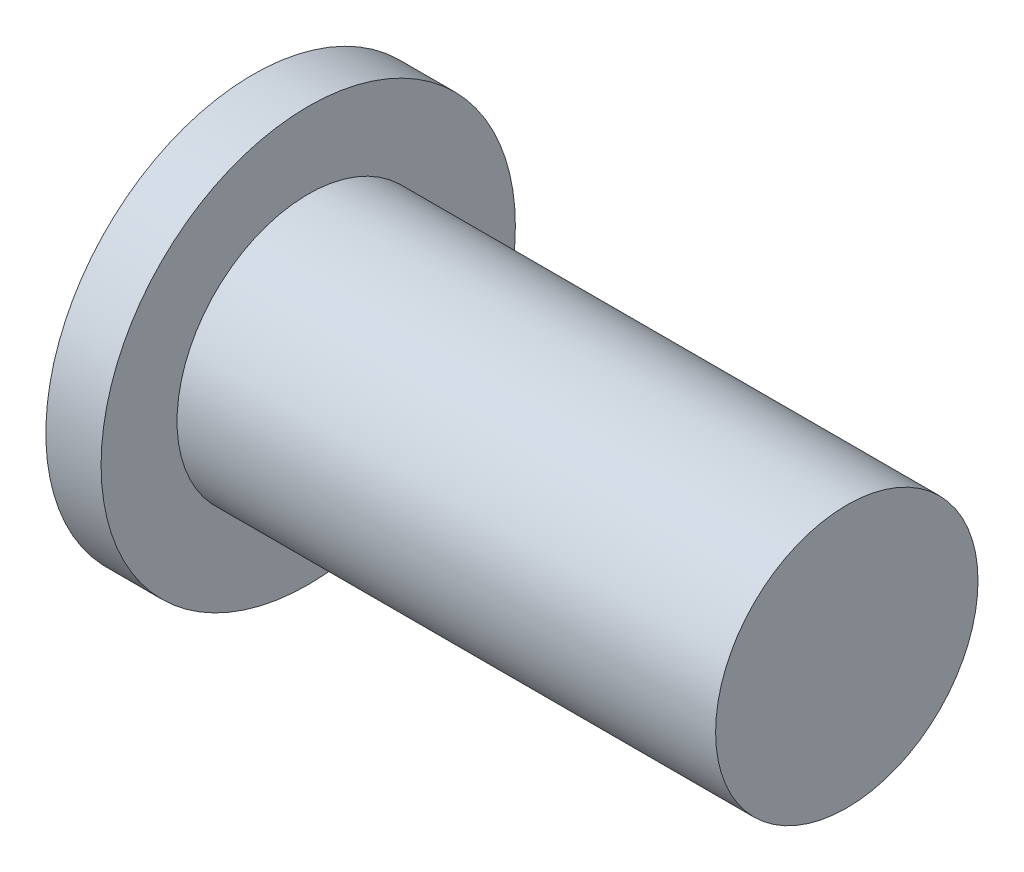
ISO-10303-21;
HEADER;
FILE_DESCRIPTION(('STEP AP214'),'2;1');
FILE_NAME('part.step','',(''),(''),'','','');
FILE_SCHEMA(('AUTOMOTIVE_DESIGN { 1 0 10303 214 1 1 1 1 }'));
ENDSEC;
DATA;
#1=APPLICATION_CONTEXT('core data for automotive mechanical design processes');
#2=APPLICATION_PROTOCOL_DEFINITION('international standard','automotive_design',2000,#1);
#3=PRODUCT_CONTEXT('',#1,'mechanical');
#4=PRODUCT('Part','Part','',(#3));
#5=PRODUCT_RELATED_PRODUCT_CATEGORY('part','',(#4));
#6=PRODUCT_DEFINITION_FORMATION('','',#4);
#7=PRODUCT_DEFINITION_CONTEXT('part definition',#1,'design');
#8=PRODUCT_DEFINITION('design','',#6,#7);
#9=PRODUCT_DEFINITION_SHAPE('','',#8);
#10=(LENGTH_UNIT() NAMED_UNIT(*) SI_UNIT(.MILLI.,.METRE.));
#11=(NAMED_UNIT(*) PLANE_ANGLE_UNIT() SI_UNIT($,.RADIAN.));
#12=(NAMED_UNIT(*) SI_UNIT($,.STERADIAN.) SOLID_ANGLE_UNIT());
#13=UNCERTAINTY_MEASURE_WITH_UNIT(LENGTH_MEASURE(1.E-05),#10,'distance_accuracy_value','');
#14=(GEOMETRIC_REPRESENTATION_CONTEXT(3) GLOBAL_UNCERTAINTY_ASSIGNED_CONTEXT((#13)) GLOBAL_UNIT_ASSIGNED_CONTEXT((#10,
#11,#12)) REPRESENTATION_CONTEXT('',''));
#15=CARTESIAN_POINT('',(0.,0.,0.));
#16=DIRECTION('',(0.,0.,1.));
#17=DIRECTION('',(1.,0.,0.));
#18=AXIS2_PLACEMENT_3D('',#15,#16,#17);
#19=CARTESIAN_POINT('',(4.3,0.,0.));
#20=DIRECTION('',(1.,0.,0.));
#21=DIRECTION('',(0.,0.,-1.));
#22=AXIS2_PLACEMENT_3D('',#19,#20,#21);
#23=PLANE('',#22);
#24=CARTESIAN_POINT('',(4.3,0.,0.));
#25=DIRECTION('',(-1.,0.,0.));
#26=DIRECTION('',(0.,0.,1.));
#27=AXIS2_PLACEMENT_3D('',#24,#25,#26);
#28=CIRCLE('',#27,1.9);
#29=CARTESIAN_POINT('',(4.3,0.,1.9));
#30=VERTEX_POINT('',#29);
#31=EDGE_CURVE('E23',#30,#30,#28,.T.);
#32=ORIENTED_EDGE('',*,*,#31,.F.);
#33=EDGE_LOOP('',(#32));
#34=FACE_BOUND('',#33,.T.);
#35=ADVANCED_FACE('F15',(#34),#23,.T.);
#36=CARTESIAN_POINT('',(-4.3,0.,0.));
#37=DIRECTION('',(1.,0.,0.));
#38=DIRECTION('',(0.,0.,-1.));
#39=AXIS2_PLACEMENT_3D('',#36,#37,#38);
#40=CYLINDRICAL_SURFACE('',#39,1.9);
#41=CARTESIAN_POINT('',(-3.5,0.,0.));
#42=DIRECTION('',(1.,0.,0.));
#43=DIRECTION('',(0.,0.,-1.));
#44=AXIS2_PLACEMENT_3D('',#41,#42,#43);
#45=CIRCLE('',#44,1.9);
#46=CARTESIAN_POINT('',(-3.5,0.,-1.9));
#47=VERTEX_POINT('',#46);
#48=EDGE_CURVE('E10',#47,#47,#45,.F.);
#49=ORIENTED_EDGE('',*,*,#48,.F.);
#50=EDGE_LOOP('',(#49));
#51=FACE_BOUND('',#50,.T.);
#52=ORIENTED_EDGE('',*,*,#31,.T.);
#53=EDGE_LOOP('',(#52));
#54=FACE_BOUND('',#53,.T.);
#55=ADVANCED_FACE('F17',(#51,#54),#40,.T.);
#56=CARTESIAN_POINT('',(-3.5,0.,0.));
#57=DIRECTION('',(1.,0.,0.));
#58=DIRECTION('',(0.,0.,-1.));
#59=AXIS2_PLACEMENT_3D('',#56,#57,#58);
#60=PLANE('',#59);
#61=ORIENTED_EDGE('',*,*,#48,.T.);
#62=EDGE_LOOP('',(#61));
#63=FACE_BOUND('',#62,.T.);
#64=CARTESIAN_POINT('',(-3.5,0.,0.));
#65=DIRECTION('',(-1.,0.,0.));
#66=DIRECTION('',(0.,0.,1.));
#67=AXIS2_PLACEMENT_3D('',#64,#65,#66);
#68=CIRCLE('',#67,3.);
#69=CARTESIAN_POINT('',(-3.5,0.,3.));
#70=VERTEX_POINT('',#69);
#71=EDGE_CURVE('E30',#70,#70,#68,.T.);
#72=ORIENTED_EDGE('',*,*,#71,.F.);
#73=EDGE_LOOP('',(#72));
#74=FACE_BOUND('',#73,.T.);
#75=ADVANCED_FACE('F49',(#63,#74),#60,.T.);
#76=CARTESIAN_POINT('',(-4.3,0.,0.));
#77=DIRECTION('',(1.,0.,0.));
#78=DIRECTION('',(0.,0.,-1.));
#79=AXIS2_PLACEMENT_3D('',#76,#77,#78);
#80=CYLINDRICAL_SURFACE('',#79,3.);
#81=ORIENTED_EDGE('',*,*,#71,.T.);
#82=EDGE_LOOP('',(#81));
#83=FACE_BOUND('',#82,.T.);
#84=CARTESIAN_POINT('',(-4.3,0.,0.));
#85=DIRECTION('',(1.,0.,0.));
#86=DIRECTION('',(0.,0.,-1.));
#87=AXIS2_PLACEMENT_3D('',#84,#85,#86);
#88=CIRCLE('',#87,3.);
#89=CARTESIAN_POINT('',(-4.3,0.,-3.));
#90=VERTEX_POINT('',#89);
#91=EDGE_CURVE('E35',#90,#90,#88,.T.);
#92=ORIENTED_EDGE('',*,*,#91,.T.);
#93=EDGE_LOOP('',(#92));
#94=FACE_BOUND('',#93,.T.);
#95=ADVANCED_FACE('F41',(#83,#94),#80,.T.);
#96=CARTESIAN_POINT('',(-4.3,0.,0.));
#97=DIRECTION('',(-1.,0.,0.));
#98=DIRECTION('',(0.,0.,1.));
#99=AXIS2_PLACEMENT_3D('',#96,#97,#98);
#100=PLANE('',#99);
#101=ORIENTED_EDGE('',*,*,#91,.F.);
#102=EDGE_LOOP('',(#101));
#103=FACE_BOUND('',#102,.T.);
#104=ADVANCED_FACE('F43',(#103),#100,.T.);
#105=CLOSED_SHELL('',(#35,#55,#75,#95,#104));
#106=MANIFOLD_SOLID_BREP('B1',#105);
#107=ADVANCED_BREP_SHAPE_REPRESENTATION('',(#18,#106),#14);
#108=SHAPE_DEFINITION_REPRESENTATION(#9,#107);
ENDSEC;
END-ISO-10303-21;
